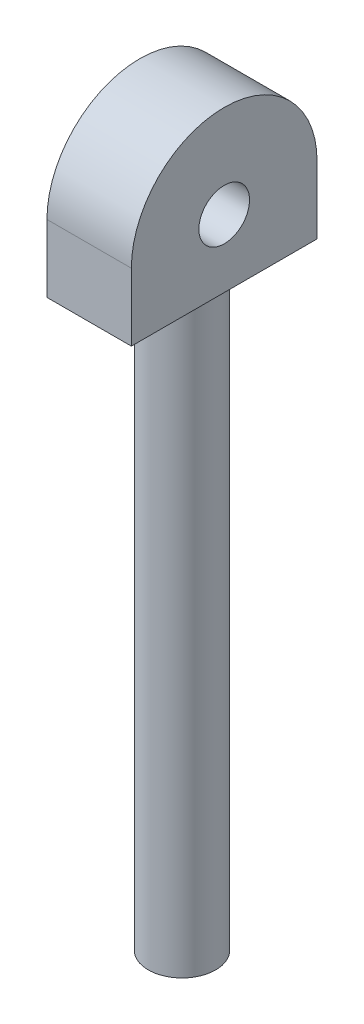
ISO-10303-21;
HEADER;
FILE_DESCRIPTION(('STEP AP214'),'2;1');
FILE_NAME('part.step','',(''),(''),'','','');
FILE_SCHEMA(('AUTOMOTIVE_DESIGN { 1 0 10303 214 1 1 1 1 }'));
ENDSEC;
DATA;
#1=APPLICATION_CONTEXT('core data for automotive mechanical design processes');
#2=APPLICATION_PROTOCOL_DEFINITION('international standard','automotive_design',2000,#1);
#3=PRODUCT_CONTEXT('',#1,'mechanical');
#4=PRODUCT('Part','Part','',(#3));
#5=PRODUCT_RELATED_PRODUCT_CATEGORY('part','',(#4));
#6=PRODUCT_DEFINITION_FORMATION('','',#4);
#7=PRODUCT_DEFINITION_CONTEXT('part definition',#1,'design');
#8=PRODUCT_DEFINITION('design','',#6,#7);
#9=PRODUCT_DEFINITION_SHAPE('','',#8);
#10=(LENGTH_UNIT() NAMED_UNIT(*) SI_UNIT(.MILLI.,.METRE.));
#11=(NAMED_UNIT(*) PLANE_ANGLE_UNIT() SI_UNIT($,.RADIAN.));
#12=(NAMED_UNIT(*) SI_UNIT($,.STERADIAN.) SOLID_ANGLE_UNIT());
#13=UNCERTAINTY_MEASURE_WITH_UNIT(LENGTH_MEASURE(1.E-05),#10,'distance_accuracy_value','');
#14=(GEOMETRIC_REPRESENTATION_CONTEXT(3) GLOBAL_UNCERTAINTY_ASSIGNED_CONTEXT((#13)) GLOBAL_UNIT_ASSIGNED_CONTEXT((#10,
#11,#12)) REPRESENTATION_CONTEXT('',''));
#15=CARTESIAN_POINT('',(0.,0.,0.));
#16=DIRECTION('',(0.,0.,1.));
#17=DIRECTION('',(1.,0.,0.));
#18=AXIS2_PLACEMENT_3D('',#15,#16,#17);
#19=CARTESIAN_POINT('',(5.,2.,0.));
#20=DIRECTION('',(1.,0.,0.));
#21=DIRECTION('',(0.,0.,-1.));
#22=AXIS2_PLACEMENT_3D('',#19,#20,#21);
#23=PLANE('',#22);
#24=CARTESIAN_POINT('',(5.,2.,0.));
#25=DIRECTION('',(1.,0.,0.));
#26=DIRECTION('',(0.,0.,-1.));
#27=AXIS2_PLACEMENT_3D('',#24,#25,#26);
#28=CIRCLE('',#27,5.49999999999999);
#29=CARTESIAN_POINT('',(5.,2.,-5.49999999999999));
#30=VERTEX_POINT('',#29);
#31=CARTESIAN_POINT('',(5.,2.,5.49999999999999));
#32=VERTEX_POINT('',#31);
#33=EDGE_CURVE('E94',#30,#32,#28,.T.);
#34=ORIENTED_EDGE('',*,*,#33,.T.);
#35=DIRECTION('',(0.,-1.,0.));
#36=VECTOR('',#35,1.);
#37=CARTESIAN_POINT('',(5.,2.,5.49999999999999));
#38=LINE('',#37,#36);
#39=CARTESIAN_POINT('',(5.,-2.,5.49999999999999));
#40=VERTEX_POINT('',#39);
#41=EDGE_CURVE('E89',#32,#40,#38,.T.);
#42=ORIENTED_EDGE('',*,*,#41,.T.);
#43=DIRECTION('',(0.,0.,-1.));
#44=VECTOR('',#43,1.);
#45=CARTESIAN_POINT('',(5.,-2.,5.49999999999999));
#46=LINE('',#45,#44);
#47=CARTESIAN_POINT('',(5.,-2.,-5.49999999999999));
#48=VERTEX_POINT('',#47);
#49=EDGE_CURVE('E92',#40,#48,#46,.T.);
#50=ORIENTED_EDGE('',*,*,#49,.T.);
#51=DIRECTION('',(0.,1.,0.));
#52=VECTOR('',#51,1.);
#53=CARTESIAN_POINT('',(5.,2.,-5.49999999999999));
#54=LINE('',#53,#52);
#55=EDGE_CURVE('E58',#48,#30,#54,.T.);
#56=ORIENTED_EDGE('',*,*,#55,.T.);
#57=EDGE_LOOP('',(#34,#42,#50,#56));
#58=FACE_BOUND('',#57,.T.);
#59=CARTESIAN_POINT('',(5.,2.,0.));
#60=DIRECTION('',(1.,0.,0.));
#61=DIRECTION('',(0.,0.,-1.));
#62=AXIS2_PLACEMENT_3D('',#59,#60,#61);
#63=CIRCLE('',#62,1.5);
#64=CARTESIAN_POINT('',(5.,2.,-1.5));
#65=VERTEX_POINT('',#64);
#66=EDGE_CURVE('E115',#65,#65,#63,.T.);
#67=ORIENTED_EDGE('',*,*,#66,.F.);
#68=EDGE_LOOP('',(#67));
#69=FACE_BOUND('',#68,.T.);
#70=ADVANCED_FACE('F39',(#58,#69),#23,.T.);
#71=CARTESIAN_POINT('',(0.,2.,0.));
#72=DIRECTION('',(1.,0.,0.));
#73=DIRECTION('',(0.,0.,-1.));
#74=AXIS2_PLACEMENT_3D('',#71,#72,#73);
#75=PLANE('',#74);
#76=CARTESIAN_POINT('',(0.,2.,0.));
#77=DIRECTION('',(1.,0.,0.));
#78=DIRECTION('',(0.,0.,-1.));
#79=AXIS2_PLACEMENT_3D('',#76,#77,#78);
#80=CIRCLE('',#79,5.49999999999999);
#81=CARTESIAN_POINT('',(0.,2.,-5.49999999999999));
#82=VERTEX_POINT('',#81);
#83=CARTESIAN_POINT('',(0.,2.,5.49999999999999));
#84=VERTEX_POINT('',#83);
#85=EDGE_CURVE('E111',#82,#84,#80,.T.);
#86=ORIENTED_EDGE('',*,*,#85,.F.);
#87=DIRECTION('',(0.,1.,0.));
#88=VECTOR('',#87,1.);
#89=CARTESIAN_POINT('',(0.,2.,-5.49999999999999));
#90=LINE('',#89,#88);
#91=CARTESIAN_POINT('',(0.,-2.,-5.49999999999999));
#92=VERTEX_POINT('',#91);
#93=EDGE_CURVE('E81',#92,#82,#90,.T.);
#94=ORIENTED_EDGE('',*,*,#93,.F.);
#95=DIRECTION('',(0.,0.,-1.));
#96=VECTOR('',#95,1.);
#97=CARTESIAN_POINT('',(0.,-2.,5.49999999999999));
#98=LINE('',#97,#96);
#99=CARTESIAN_POINT('',(0.,-2.,5.49999999999999));
#100=VERTEX_POINT('',#99);
#101=EDGE_CURVE('E75',#100,#92,#98,.T.);
#102=ORIENTED_EDGE('',*,*,#101,.F.);
#103=DIRECTION('',(0.,-1.,0.));
#104=VECTOR('',#103,1.);
#105=CARTESIAN_POINT('',(0.,2.,5.49999999999999));
#106=LINE('',#105,#104);
#107=EDGE_CURVE('E100',#84,#100,#106,.T.);
#108=ORIENTED_EDGE('',*,*,#107,.F.);
#109=EDGE_LOOP('',(#86,#94,#102,#108));
#110=FACE_BOUND('',#109,.T.);
#111=CARTESIAN_POINT('',(0.,2.,0.));
#112=DIRECTION('',(1.,0.,0.));
#113=DIRECTION('',(0.,0.,-1.));
#114=AXIS2_PLACEMENT_3D('',#111,#112,#113);
#115=CIRCLE('',#114,1.5);
#116=CARTESIAN_POINT('',(0.,2.,-1.5));
#117=VERTEX_POINT('',#116);
#118=EDGE_CURVE('E133',#117,#117,#115,.T.);
#119=ORIENTED_EDGE('',*,*,#118,.T.);
#120=EDGE_LOOP('',(#119));
#121=FACE_BOUND('',#120,.T.);
#122=ADVANCED_FACE('F128',(#110,#121),#75,.F.);
#123=CARTESIAN_POINT('',(5.,2.,0.));
#124=DIRECTION('',(-1.,0.,0.));
#125=DIRECTION('',(0.,0.,1.));
#126=AXIS2_PLACEMENT_3D('',#123,#124,#125);
#127=CYLINDRICAL_SURFACE('',#126,5.49999999999999);
#128=ORIENTED_EDGE('',*,*,#85,.T.);
#129=DIRECTION('',(-1.,0.,0.));
#130=VECTOR('',#129,1.);
#131=CARTESIAN_POINT('',(5.,2.,5.49999999999999));
#132=LINE('',#131,#130);
#133=EDGE_CURVE('E43',#32,#84,#132,.T.);
#134=ORIENTED_EDGE('',*,*,#133,.F.);
#135=ORIENTED_EDGE('',*,*,#33,.F.);
#136=DIRECTION('',(-1.,0.,0.));
#137=VECTOR('',#136,1.);
#138=CARTESIAN_POINT('',(5.,2.,-5.49999999999999));
#139=LINE('',#138,#137);
#140=EDGE_CURVE('E107',#30,#82,#139,.T.);
#141=ORIENTED_EDGE('',*,*,#140,.T.);
#142=EDGE_LOOP('',(#128,#134,#135,#141));
#143=FACE_BOUND('',#142,.T.);
#144=ADVANCED_FACE('F41',(#143),#127,.T.);
#145=CARTESIAN_POINT('',(5.,2.,5.49999999999999));
#146=DIRECTION('',(0.,0.,-1.));
#147=DIRECTION('',(-1.,0.,0.));
#148=AXIS2_PLACEMENT_3D('',#145,#146,#147);
#149=PLANE('',#148);
#150=ORIENTED_EDGE('',*,*,#107,.T.);
#151=DIRECTION('',(-1.,0.,0.));
#152=VECTOR('',#151,1.);
#153=CARTESIAN_POINT('',(5.,-2.,5.49999999999999));
#154=LINE('',#153,#152);
#155=EDGE_CURVE('E98',#40,#100,#154,.T.);
#156=ORIENTED_EDGE('',*,*,#155,.F.);
#157=ORIENTED_EDGE('',*,*,#41,.F.);
#158=ORIENTED_EDGE('',*,*,#133,.T.);
#159=EDGE_LOOP('',(#150,#156,#157,#158));
#160=FACE_BOUND('',#159,.T.);
#161=ADVANCED_FACE('F99',(#160),#149,.F.);
#162=CARTESIAN_POINT('',(5.,-2.,5.49999999999999));
#163=DIRECTION('',(0.,1.,0.));
#164=DIRECTION('',(0.,0.,1.));
#165=AXIS2_PLACEMENT_3D('',#162,#163,#164);
#166=PLANE('',#165);
#167=CARTESIAN_POINT('',(2.5,-2.,0.));
#168=DIRECTION('',(0.,-1.,0.));
#169=DIRECTION('',(0.,0.,-1.));
#170=AXIS2_PLACEMENT_3D('',#167,#168,#169);
#171=CIRCLE('',#170,2.);
#172=CARTESIAN_POINT('',(2.5,-2.,-2.00000000000001));
#173=VERTEX_POINT('',#172);
#174=EDGE_CURVE('E11',#173,#173,#171,.T.);
#175=ORIENTED_EDGE('',*,*,#174,.F.);
#176=EDGE_LOOP('',(#175));
#177=FACE_BOUND('',#176,.T.);
#178=ORIENTED_EDGE('',*,*,#101,.T.);
#179=DIRECTION('',(-1.,0.,0.));
#180=VECTOR('',#179,1.);
#181=CARTESIAN_POINT('',(5.,-2.,-5.49999999999999));
#182=LINE('',#181,#180);
#183=EDGE_CURVE('E102',#48,#92,#182,.T.);
#184=ORIENTED_EDGE('',*,*,#183,.F.);
#185=ORIENTED_EDGE('',*,*,#49,.F.);
#186=ORIENTED_EDGE('',*,*,#155,.T.);
#187=EDGE_LOOP('',(#178,#184,#185,#186));
#188=FACE_BOUND('',#187,.T.);
#189=ADVANCED_FACE('F103',(#177,#188),#166,.F.);
#190=CARTESIAN_POINT('',(5.,2.,-5.49999999999999));
#191=DIRECTION('',(0.,0.,1.));
#192=DIRECTION('',(1.,0.,0.));
#193=AXIS2_PLACEMENT_3D('',#190,#191,#192);
#194=PLANE('',#193);
#195=ORIENTED_EDGE('',*,*,#93,.T.);
#196=ORIENTED_EDGE('',*,*,#140,.F.);
#197=ORIENTED_EDGE('',*,*,#55,.F.);
#198=ORIENTED_EDGE('',*,*,#183,.T.);
#199=EDGE_LOOP('',(#195,#196,#197,#198));
#200=FACE_BOUND('',#199,.T.);
#201=ADVANCED_FACE('F125',(#200),#194,.F.);
#202=CARTESIAN_POINT('',(5.,2.,0.));
#203=DIRECTION('',(-1.,0.,0.));
#204=DIRECTION('',(0.,0.,1.));
#205=AXIS2_PLACEMENT_3D('',#202,#203,#204);
#206=CYLINDRICAL_SURFACE('',#205,1.5);
#207=ORIENTED_EDGE('',*,*,#66,.T.);
#208=EDGE_LOOP('',(#207));
#209=FACE_BOUND('',#208,.T.);
#210=ORIENTED_EDGE('',*,*,#118,.F.);
#211=EDGE_LOOP('',(#210));
#212=FACE_BOUND('',#211,.T.);
#213=ADVANCED_FACE('F150',(#209,#212),#206,.F.);
#214=CARTESIAN_POINT('',(2.5,-37.,0.));
#215=DIRECTION('',(0.,1.,0.));
#216=DIRECTION('',(0.,0.,1.));
#217=AXIS2_PLACEMENT_3D('',#214,#215,#216);
#218=CYLINDRICAL_SURFACE('',#217,2.);
#219=CARTESIAN_POINT('',(2.5,-37.,0.));
#220=DIRECTION('',(0.,-1.,0.));
#221=DIRECTION('',(0.,0.,-1.));
#222=AXIS2_PLACEMENT_3D('',#219,#220,#221);
#223=CIRCLE('',#222,2.);
#224=CARTESIAN_POINT('',(2.5,-37.,-2.00000000000001));
#225=VERTEX_POINT('',#224);
#226=EDGE_CURVE('E137',#225,#225,#223,.T.);
#227=ORIENTED_EDGE('',*,*,#226,.F.);
#228=EDGE_LOOP('',(#227));
#229=FACE_BOUND('',#228,.T.);
#230=ORIENTED_EDGE('',*,*,#174,.T.);
#231=EDGE_LOOP('',(#230));
#232=FACE_BOUND('',#231,.T.);
#233=ADVANCED_FACE('F147',(#229,#232),#218,.T.);
#234=CARTESIAN_POINT('',(2.5,-37.,0.));
#235=DIRECTION('',(0.,-1.,0.));
#236=DIRECTION('',(0.,0.,-1.));
#237=AXIS2_PLACEMENT_3D('',#234,#235,#236);
#238=PLANE('',#237);
#239=ORIENTED_EDGE('',*,*,#226,.T.);
#240=EDGE_LOOP('',(#239));
#241=FACE_BOUND('',#240,.T.);
#242=ADVANCED_FACE('F145',(#241),#238,.T.);
#243=CLOSED_SHELL('',(#70,#122,#144,#161,#189,#201,#213,#233,#242));
#244=MANIFOLD_SOLID_BREP('B2',#243);
#245=ADVANCED_BREP_SHAPE_REPRESENTATION('',(#18,#244),#14);
#246=SHAPE_DEFINITION_REPRESENTATION(#9,#245);
ENDSEC;
END-ISO-10303-21;
